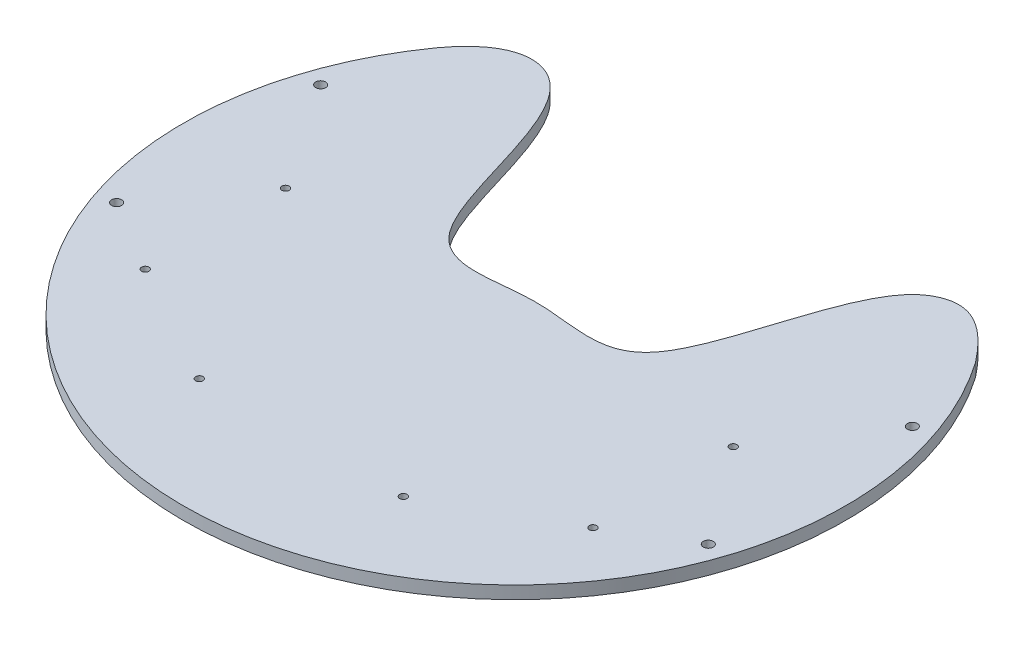
ISO-10303-21;
HEADER;
FILE_DESCRIPTION(('STEP AP214'),'2;1');
FILE_NAME('part.step','',(''),(''),'','','');
FILE_SCHEMA(('AUTOMOTIVE_DESIGN { 1 0 10303 214 1 1 1 1 }'));
ENDSEC;
DATA;
#1=APPLICATION_CONTEXT('core data for automotive mechanical design processes');
#2=APPLICATION_PROTOCOL_DEFINITION('international standard','automotive_design',2000,#1);
#3=PRODUCT_CONTEXT('',#1,'mechanical');
#4=PRODUCT('Part','Part','',(#3));
#5=PRODUCT_RELATED_PRODUCT_CATEGORY('part','',(#4));
#6=PRODUCT_DEFINITION_FORMATION('','',#4);
#7=PRODUCT_DEFINITION_CONTEXT('part definition',#1,'design');
#8=PRODUCT_DEFINITION('design','',#6,#7);
#9=PRODUCT_DEFINITION_SHAPE('','',#8);
#10=(LENGTH_UNIT() NAMED_UNIT(*) SI_UNIT(.MILLI.,.METRE.));
#11=(NAMED_UNIT(*) PLANE_ANGLE_UNIT() SI_UNIT($,.RADIAN.));
#12=(NAMED_UNIT(*) SI_UNIT($,.STERADIAN.) SOLID_ANGLE_UNIT());
#13=UNCERTAINTY_MEASURE_WITH_UNIT(LENGTH_MEASURE(1.E-05),#10,'distance_accuracy_value','');
#14=(GEOMETRIC_REPRESENTATION_CONTEXT(3) GLOBAL_UNCERTAINTY_ASSIGNED_CONTEXT((#13)) GLOBAL_UNIT_ASSIGNED_CONTEXT((#10,
#11,#12)) REPRESENTATION_CONTEXT('',''));
#15=CARTESIAN_POINT('',(0.,0.,0.));
#16=DIRECTION('',(0.,0.,1.));
#17=DIRECTION('',(1.,0.,0.));
#18=AXIS2_PLACEMENT_3D('',#15,#16,#17);
#19=CARTESIAN_POINT('',(0.,6.35,0.));
#20=DIRECTION('',(0.,-1.,0.));
#21=DIRECTION('',(0.,0.,-1.));
#22=AXIS2_PLACEMENT_3D('',#19,#20,#21);
#23=CYLINDRICAL_SURFACE('',#22,164.975);
#24=DIRECTION('',(0.,-1.,0.));
#25=VECTOR('',#24,1.);
#26=CARTESIAN_POINT('',(135.559273801903,589.678712407293,-94.0235816766237));
#27=LINE('',#26,#25);
#28=CARTESIAN_POINT('',(135.559273801903,6.35,-94.0235816766237));
#29=VERTEX_POINT('',#28);
#30=CARTESIAN_POINT('',(135.559273801903,0.,-94.0235816766237));
#31=VERTEX_POINT('',#30);
#32=EDGE_CURVE('E71',#29,#31,#27,.T.);
#33=ORIENTED_EDGE('',*,*,#32,.F.);
#34=CARTESIAN_POINT('',(0.,6.35,0.));
#35=DIRECTION('',(0.,1.,0.));
#36=DIRECTION('',(0.,0.,1.));
#37=AXIS2_PLACEMENT_3D('',#34,#35,#36);
#38=CIRCLE('',#37,164.975);
#39=CARTESIAN_POINT('',(-134.51490515471,6.35,-95.5117318250461));
#40=VERTEX_POINT('',#39);
#41=EDGE_CURVE('E43',#40,#29,#38,.T.);
#42=ORIENTED_EDGE('',*,*,#41,.F.);
#43=DIRECTION('',(0.,-1.,0.));
#44=VECTOR('',#43,1.);
#45=CARTESIAN_POINT('',(-134.514905154706,589.678712407293,-95.5117318250508));
#46=LINE('',#45,#44);
#47=CARTESIAN_POINT('',(-134.51490515471,0.,-95.511731825046));
#48=VERTEX_POINT('',#47);
#49=EDGE_CURVE('E69',#48,#40,#46,.F.);
#50=ORIENTED_EDGE('',*,*,#49,.F.);
#51=CARTESIAN_POINT('',(0.,0.,0.));
#52=DIRECTION('',(0.,1.,0.));
#53=DIRECTION('',(0.,0.,1.));
#54=AXIS2_PLACEMENT_3D('',#51,#52,#53);
#55=CIRCLE('',#54,164.975);
#56=EDGE_CURVE('E61',#48,#31,#55,.T.);
#57=ORIENTED_EDGE('',*,*,#56,.T.);
#58=EDGE_LOOP('',(#33,#42,#50,#57));
#59=FACE_BOUND('',#58,.T.);
#60=ADVANCED_FACE('F35',(#59),#23,.T.);
#61=CARTESIAN_POINT('',(0.,6.35,0.));
#62=DIRECTION('',(0.,1.,0.));
#63=DIRECTION('',(0.,0.,1.));
#64=AXIS2_PLACEMENT_3D('',#61,#62,#63);
#65=PLANE('',#64);
#66=CARTESIAN_POINT('',(-147.32,6.35,-50.8));
#67=DIRECTION('',(0.,1.,0.));
#68=DIRECTION('',(0.,0.,1.));
#69=AXIS2_PLACEMENT_3D('',#66,#67,#68);
#70=CIRCLE('',#69,2.4892);
#71=CARTESIAN_POINT('',(-147.32,6.35,-48.3108));
#72=VERTEX_POINT('',#71);
#73=EDGE_CURVE('E272',#72,#72,#70,.T.);
#74=ORIENTED_EDGE('',*,*,#73,.F.);
#75=EDGE_LOOP('',(#74));
#76=FACE_BOUND('',#75,.T.);
#77=CARTESIAN_POINT('',(-147.32,6.35,50.8));
#78=DIRECTION('',(0.,1.,0.));
#79=DIRECTION('',(0.,0.,1.));
#80=AXIS2_PLACEMENT_3D('',#77,#78,#79);
#81=CIRCLE('',#80,2.4892);
#82=CARTESIAN_POINT('',(-147.32,6.35,53.2892));
#83=VERTEX_POINT('',#82);
#84=EDGE_CURVE('E274',#83,#83,#81,.T.);
#85=ORIENTED_EDGE('',*,*,#84,.F.);
#86=EDGE_LOOP('',(#85));
#87=FACE_BOUND('',#86,.T.);
#88=CARTESIAN_POINT('',(147.32,6.35,-50.8));
#89=DIRECTION('',(0.,1.,0.));
#90=DIRECTION('',(0.,0.,1.));
#91=AXIS2_PLACEMENT_3D('',#88,#89,#90);
#92=CIRCLE('',#91,2.4892);
#93=CARTESIAN_POINT('',(147.32,6.35,-48.3108));
#94=VERTEX_POINT('',#93);
#95=EDGE_CURVE('E282',#94,#94,#92,.T.);
#96=ORIENTED_EDGE('',*,*,#95,.F.);
#97=EDGE_LOOP('',(#96));
#98=FACE_BOUND('',#97,.T.);
#99=CARTESIAN_POINT('',(147.32,6.35,50.8));
#100=DIRECTION('',(0.,1.,0.));
#101=DIRECTION('',(0.,0.,1.));
#102=AXIS2_PLACEMENT_3D('',#99,#100,#101);
#103=CIRCLE('',#102,2.4892);
#104=CARTESIAN_POINT('',(147.32,6.35,53.2892));
#105=VERTEX_POINT('',#104);
#106=EDGE_CURVE('E288',#105,#105,#103,.T.);
#107=ORIENTED_EDGE('',*,*,#106,.F.);
#108=EDGE_LOOP('',(#107));
#109=FACE_BOUND('',#108,.T.);
#110=CARTESIAN_POINT('',(50.8,6.35,106.158945667331));
#111=DIRECTION('',(0.,1.,0.));
#112=DIRECTION('',(0.,0.,1.));
#113=AXIS2_PLACEMENT_3D('',#110,#111,#112);
#114=CIRCLE('',#113,1.82879999999999);
#115=CARTESIAN_POINT('',(50.8,6.35,107.987745667331));
#116=VERTEX_POINT('',#115);
#117=EDGE_CURVE('E294',#116,#116,#114,.T.);
#118=ORIENTED_EDGE('',*,*,#117,.F.);
#119=EDGE_LOOP('',(#118));
#120=FACE_BOUND('',#119,.T.);
#121=CARTESIAN_POINT('',(-50.8,6.35,106.158945667331));
#122=DIRECTION('',(0.,1.,0.));
#123=DIRECTION('',(0.,0.,1.));
#124=AXIS2_PLACEMENT_3D('',#121,#122,#123);
#125=CIRCLE('',#124,1.82879999999999);
#126=CARTESIAN_POINT('',(-50.8,6.35,107.987745667331));
#127=VERTEX_POINT('',#126);
#128=EDGE_CURVE('E77',#127,#127,#125,.T.);
#129=ORIENTED_EDGE('',*,*,#128,.F.);
#130=EDGE_LOOP('',(#129));
#131=FACE_BOUND('',#130,.T.);
#132=CARTESIAN_POINT('',(-111.465,6.35,2.54));
#133=DIRECTION('',(0.,-1.,0.));
#134=DIRECTION('',(0.,0.,-1.));
#135=AXIS2_PLACEMENT_3D('',#132,#133,#134);
#136=CIRCLE('',#135,1.82879999999999);
#137=CARTESIAN_POINT('',(-111.465,6.35,0.711200000000009));
#138=VERTEX_POINT('',#137);
#139=EDGE_CURVE('E66',#138,#138,#136,.T.);
#140=ORIENTED_EDGE('',*,*,#139,.T.);
#141=EDGE_LOOP('',(#140));
#142=FACE_BOUND('',#141,.T.);
#143=CARTESIAN_POINT('',(-111.465,6.35,72.39));
#144=DIRECTION('',(0.,-1.,0.));
#145=DIRECTION('',(0.,0.,-1.));
#146=AXIS2_PLACEMENT_3D('',#143,#144,#145);
#147=CIRCLE('',#146,1.82879999999999);
#148=CARTESIAN_POINT('',(-111.465,6.35,70.5612));
#149=VERTEX_POINT('',#148);
#150=EDGE_CURVE('E105',#149,#149,#147,.T.);
#151=ORIENTED_EDGE('',*,*,#150,.T.);
#152=EDGE_LOOP('',(#151));
#153=FACE_BOUND('',#152,.T.);
#154=CARTESIAN_POINT('',(111.465,6.35,2.54));
#155=DIRECTION('',(0.,-1.,0.));
#156=DIRECTION('',(0.,0.,-1.));
#157=AXIS2_PLACEMENT_3D('',#154,#155,#156);
#158=CIRCLE('',#157,1.82879999999999);
#159=CARTESIAN_POINT('',(111.465,6.35,0.711200000000009));
#160=VERTEX_POINT('',#159);
#161=EDGE_CURVE('E99',#160,#160,#158,.T.);
#162=ORIENTED_EDGE('',*,*,#161,.T.);
#163=EDGE_LOOP('',(#162));
#164=FACE_BOUND('',#163,.T.);
#165=CARTESIAN_POINT('',(111.465,6.35,72.39));
#166=DIRECTION('',(0.,-1.,0.));
#167=DIRECTION('',(0.,0.,-1.));
#168=AXIS2_PLACEMENT_3D('',#165,#166,#167);
#169=CIRCLE('',#168,1.82879999999999);
#170=CARTESIAN_POINT('',(111.465,6.35,70.5612));
#171=VERTEX_POINT('',#170);
#172=EDGE_CURVE('E93',#171,#171,#169,.T.);
#173=ORIENTED_EDGE('',*,*,#172,.T.);
#174=EDGE_LOOP('',(#173));
#175=FACE_BOUND('',#174,.T.);
#176=ORIENTED_EDGE('',*,*,#41,.T.);
#177=CARTESIAN_POINT('',(-135.559273801902,6.34999999999997,-94.0235816766245));
#178=CARTESIAN_POINT('',(-123.865738236216,6.34999999999997,-111.077159006112));
#179=CARTESIAN_POINT('',(-106.449977637645,6.34999999999997,-118.585350672143));
#180=CARTESIAN_POINT('',(-71.3901870554499,6.34999999999997,-97.759614566911));
#181=CARTESIAN_POINT('',(-62.1016103392255,6.34999999999997,5.97104789695598));
#182=CARTESIAN_POINT('',(0.172013058589702,6.34999999999997,-18.1838006858238));
#183=CARTESIAN_POINT('',(61.3361651321419,6.34999999999997,6.05350296978897));
#184=CARTESIAN_POINT('',(73.4950138951308,6.34999999999997,-97.956010729616));
#185=CARTESIAN_POINT('',(105.334247952647,6.34999999999997,-118.220752119144));
#186=CARTESIAN_POINT('',(120.05372767283,6.34999999999997,-114.006940105104));
#187=CARTESIAN_POINT('',(135.559273801903,6.34999999999997,-94.0235816766237));
#188=B_SPLINE_CURVE_WITH_KNOTS('',3,(#177,#178,#179,#180,#181,#182,#183,#184,#185,#186,#187),
.UNSPECIFIED.,.F.,.F.,(4,1,1,1,1,1,1,1,4),(0.,0.0968227127982241,0.130284198374629,
0.33461485576405,0.501420490021093,0.66822612427814,0.872556781883865,0.905734169456051,1.),.UNSPECIFIED.);
#189=EDGE_CURVE('E50',#29,#40,#188,.F.);
#190=ORIENTED_EDGE('',*,*,#189,.T.);
#191=EDGE_LOOP('',(#176,#190));
#192=FACE_BOUND('',#191,.T.);
#193=ADVANCED_FACE('F120',(#76,#87,#98,#109,#120,#131,#142,#153,#164,#175,#192),#65,.T.);
#194=CARTESIAN_POINT('',(0.,0.,0.));
#195=DIRECTION('',(0.,1.,0.));
#196=DIRECTION('',(0.,0.,1.));
#197=AXIS2_PLACEMENT_3D('',#194,#195,#196);
#198=PLANE('',#197);
#199=CARTESIAN_POINT('',(-147.32,1.43982048506075E-13,-50.8));
#200=DIRECTION('',(0.,1.,0.));
#201=DIRECTION('',(0.,0.,1.));
#202=AXIS2_PLACEMENT_3D('',#199,#200,#201);
#203=CIRCLE('',#202,2.48919999999975);
#204=CARTESIAN_POINT('',(-147.32,1.43982048506075E-13,-48.3108000000002));
#205=VERTEX_POINT('',#204);
#206=EDGE_CURVE('E270',#205,#205,#203,.T.);
#207=ORIENTED_EDGE('',*,*,#206,.T.);
#208=EDGE_LOOP('',(#207));
#209=FACE_BOUND('',#208,.T.);
#210=CARTESIAN_POINT('',(-147.32,1.43982048506075E-13,50.8));
#211=DIRECTION('',(0.,1.,0.));
#212=DIRECTION('',(0.,0.,1.));
#213=AXIS2_PLACEMENT_3D('',#210,#211,#212);
#214=CIRCLE('',#213,2.48919999999975);
#215=CARTESIAN_POINT('',(-147.32,1.43982048506075E-13,53.2891999999997));
#216=VERTEX_POINT('',#215);
#217=EDGE_CURVE('E279',#216,#216,#214,.T.);
#218=ORIENTED_EDGE('',*,*,#217,.T.);
#219=EDGE_LOOP('',(#218));
#220=FACE_BOUND('',#219,.T.);
#221=CARTESIAN_POINT('',(147.32,1.43982048506075E-13,-50.8));
#222=DIRECTION('',(0.,1.,0.));
#223=DIRECTION('',(0.,0.,1.));
#224=AXIS2_PLACEMENT_3D('',#221,#222,#223);
#225=CIRCLE('',#224,2.48919999999975);
#226=CARTESIAN_POINT('',(147.32,1.43982048506075E-13,-48.3108000000002));
#227=VERTEX_POINT('',#226);
#228=EDGE_CURVE('E285',#227,#227,#225,.T.);
#229=ORIENTED_EDGE('',*,*,#228,.T.);
#230=EDGE_LOOP('',(#229));
#231=FACE_BOUND('',#230,.T.);
#232=CARTESIAN_POINT('',(147.32,1.43982048506075E-13,50.8));
#233=DIRECTION('',(0.,1.,0.));
#234=DIRECTION('',(0.,0.,1.));
#235=AXIS2_PLACEMENT_3D('',#232,#233,#234);
#236=CIRCLE('',#235,2.48919999999975);
#237=CARTESIAN_POINT('',(147.32,1.43982048506075E-13,53.2891999999997));
#238=VERTEX_POINT('',#237);
#239=EDGE_CURVE('E291',#238,#238,#236,.T.);
#240=ORIENTED_EDGE('',*,*,#239,.T.);
#241=EDGE_LOOP('',(#240));
#242=FACE_BOUND('',#241,.T.);
#243=CARTESIAN_POINT('',(50.8,0.,106.158945667331));
#244=DIRECTION('',(0.,1.,0.));
#245=DIRECTION('',(0.,0.,1.));
#246=AXIS2_PLACEMENT_3D('',#243,#244,#245);
#247=CIRCLE('',#246,1.82879999999999);
#248=CARTESIAN_POINT('',(50.8,0.,107.987745667331));
#249=VERTEX_POINT('',#248);
#250=EDGE_CURVE('E38',#249,#249,#247,.T.);
#251=ORIENTED_EDGE('',*,*,#250,.T.);
#252=EDGE_LOOP('',(#251));
#253=FACE_BOUND('',#252,.T.);
#254=CARTESIAN_POINT('',(-50.8,0.,106.158945667331));
#255=DIRECTION('',(0.,1.,0.));
#256=DIRECTION('',(0.,0.,1.));
#257=AXIS2_PLACEMENT_3D('',#254,#255,#256);
#258=CIRCLE('',#257,1.82879999999999);
#259=CARTESIAN_POINT('',(-50.8,0.,107.987745667331));
#260=VERTEX_POINT('',#259);
#261=EDGE_CURVE('E74',#260,#260,#258,.T.);
#262=ORIENTED_EDGE('',*,*,#261,.T.);
#263=EDGE_LOOP('',(#262));
#264=FACE_BOUND('',#263,.T.);
#265=CARTESIAN_POINT('',(-111.465,0.,2.54));
#266=DIRECTION('',(0.,-1.,0.));
#267=DIRECTION('',(0.,0.,-1.));
#268=AXIS2_PLACEMENT_3D('',#265,#266,#267);
#269=CIRCLE('',#268,1.82879999999999);
#270=CARTESIAN_POINT('',(-111.465,0.,0.711200000000009));
#271=VERTEX_POINT('',#270);
#272=EDGE_CURVE('E108',#271,#271,#269,.T.);
#273=ORIENTED_EDGE('',*,*,#272,.F.);
#274=EDGE_LOOP('',(#273));
#275=FACE_BOUND('',#274,.T.);
#276=CARTESIAN_POINT('',(-111.465,0.,72.39));
#277=DIRECTION('',(0.,-1.,0.));
#278=DIRECTION('',(0.,0.,-1.));
#279=AXIS2_PLACEMENT_3D('',#276,#277,#278);
#280=CIRCLE('',#279,1.82879999999999);
#281=CARTESIAN_POINT('',(-111.465,0.,70.5612));
#282=VERTEX_POINT('',#281);
#283=EDGE_CURVE('E102',#282,#282,#280,.T.);
#284=ORIENTED_EDGE('',*,*,#283,.F.);
#285=EDGE_LOOP('',(#284));
#286=FACE_BOUND('',#285,.T.);
#287=CARTESIAN_POINT('',(111.465,0.,2.54));
#288=DIRECTION('',(0.,-1.,0.));
#289=DIRECTION('',(0.,0.,-1.));
#290=AXIS2_PLACEMENT_3D('',#287,#288,#289);
#291=CIRCLE('',#290,1.82879999999999);
#292=CARTESIAN_POINT('',(111.465,0.,0.711200000000009));
#293=VERTEX_POINT('',#292);
#294=EDGE_CURVE('E96',#293,#293,#291,.T.);
#295=ORIENTED_EDGE('',*,*,#294,.F.);
#296=EDGE_LOOP('',(#295));
#297=FACE_BOUND('',#296,.T.);
#298=CARTESIAN_POINT('',(111.465,0.,72.39));
#299=DIRECTION('',(0.,-1.,0.));
#300=DIRECTION('',(0.,0.,-1.));
#301=AXIS2_PLACEMENT_3D('',#298,#299,#300);
#302=CIRCLE('',#301,1.82879999999999);
#303=CARTESIAN_POINT('',(111.465,0.,70.5612));
#304=VERTEX_POINT('',#303);
#305=EDGE_CURVE('E87',#304,#304,#302,.T.);
#306=ORIENTED_EDGE('',*,*,#305,.F.);
#307=EDGE_LOOP('',(#306));
#308=FACE_BOUND('',#307,.T.);
#309=CARTESIAN_POINT('',(-135.559273801902,0.,-94.0235816766245));
#310=CARTESIAN_POINT('',(-123.865738236216,0.,-111.077159006112));
#311=CARTESIAN_POINT('',(-106.449977637645,0.,-118.585350672143));
#312=CARTESIAN_POINT('',(-71.3901870554499,0.,-97.759614566911));
#313=CARTESIAN_POINT('',(-62.1016103392255,0.,5.97104789695598));
#314=CARTESIAN_POINT('',(0.172013058589702,0.,-18.1838006858238));
#315=CARTESIAN_POINT('',(61.3361651321419,0.,6.05350296978897));
#316=CARTESIAN_POINT('',(73.4950138951308,0.,-97.956010729616));
#317=CARTESIAN_POINT('',(105.334247952647,0.,-118.220752119144));
#318=CARTESIAN_POINT('',(120.05372767283,0.,-114.006940105104));
#319=CARTESIAN_POINT('',(135.559273801903,0.,-94.0235816766237));
#320=B_SPLINE_CURVE_WITH_KNOTS('',3,(#309,#310,#311,#312,#313,#314,#315,#316,#317,#318,#319),
.UNSPECIFIED.,.F.,.F.,(4,1,1,1,1,1,1,1,4),(0.,0.0968227127982241,0.130284198374629,
0.33461485576405,0.501420490021093,0.66822612427814,0.872556781883865,0.905734169456051,1.),.UNSPECIFIED.);
#321=EDGE_CURVE('E11',#31,#48,#320,.F.);
#322=ORIENTED_EDGE('',*,*,#321,.F.);
#323=ORIENTED_EDGE('',*,*,#56,.F.);
#324=EDGE_LOOP('',(#322,#323));
#325=FACE_BOUND('',#324,.T.);
#326=ADVANCED_FACE('F63',(#209,#220,#231,#242,#253,#264,#275,#286,#297,#308,#325),#198,.F.);
#327=CARTESIAN_POINT('',(-111.465,0.,2.54));
#328=DIRECTION('',(0.,-1.,0.));
#329=DIRECTION('',(0.,0.,-1.));
#330=AXIS2_PLACEMENT_3D('',#327,#328,#329);
#331=CYLINDRICAL_SURFACE('',#330,1.82879999999999);
#332=ORIENTED_EDGE('',*,*,#139,.F.);
#333=EDGE_LOOP('',(#332));
#334=FACE_BOUND('',#333,.T.);
#335=ORIENTED_EDGE('',*,*,#272,.T.);
#336=EDGE_LOOP('',(#335));
#337=FACE_BOUND('',#336,.T.);
#338=ADVANCED_FACE('F123',(#334,#337),#331,.F.);
#339=CARTESIAN_POINT('',(-111.465,0.,72.39));
#340=DIRECTION('',(0.,-1.,0.));
#341=DIRECTION('',(0.,0.,-1.));
#342=AXIS2_PLACEMENT_3D('',#339,#340,#341);
#343=CYLINDRICAL_SURFACE('',#342,1.82879999999999);
#344=ORIENTED_EDGE('',*,*,#150,.F.);
#345=EDGE_LOOP('',(#344));
#346=FACE_BOUND('',#345,.T.);
#347=ORIENTED_EDGE('',*,*,#283,.T.);
#348=EDGE_LOOP('',(#347));
#349=FACE_BOUND('',#348,.T.);
#350=ADVANCED_FACE('F126',(#346,#349),#343,.F.);
#351=CARTESIAN_POINT('',(111.465,0.,2.54));
#352=DIRECTION('',(0.,-1.,0.));
#353=DIRECTION('',(0.,0.,-1.));
#354=AXIS2_PLACEMENT_3D('',#351,#352,#353);
#355=CYLINDRICAL_SURFACE('',#354,1.82879999999999);
#356=ORIENTED_EDGE('',*,*,#161,.F.);
#357=EDGE_LOOP('',(#356));
#358=FACE_BOUND('',#357,.T.);
#359=ORIENTED_EDGE('',*,*,#294,.T.);
#360=EDGE_LOOP('',(#359));
#361=FACE_BOUND('',#360,.T.);
#362=ADVANCED_FACE('F141',(#358,#361),#355,.F.);
#363=CARTESIAN_POINT('',(111.465,0.,72.39));
#364=DIRECTION('',(0.,-1.,0.));
#365=DIRECTION('',(0.,0.,-1.));
#366=AXIS2_PLACEMENT_3D('',#363,#364,#365);
#367=CYLINDRICAL_SURFACE('',#366,1.82879999999999);
#368=ORIENTED_EDGE('',*,*,#172,.F.);
#369=EDGE_LOOP('',(#368));
#370=FACE_BOUND('',#369,.T.);
#371=ORIENTED_EDGE('',*,*,#305,.T.);
#372=EDGE_LOOP('',(#371));
#373=FACE_BOUND('',#372,.T.);
#374=ADVANCED_FACE('F139',(#370,#373),#367,.F.);
#375=CARTESIAN_POINT('',(-135.559273801902,589.678712407293,-94.0235816766245));
#376=CARTESIAN_POINT('',(-123.865738236216,589.678712407293,-111.077159006112));
#377=CARTESIAN_POINT('',(-106.449977637645,589.678712407293,-118.585350672143));
#378=CARTESIAN_POINT('',(-71.3901870554499,589.678712407293,-97.759614566911));
#379=CARTESIAN_POINT('',(-62.1016103392255,589.678712407293,5.97104789695598));
#380=CARTESIAN_POINT('',(0.172013058589702,589.678712407293,-18.1838006858238));
#381=CARTESIAN_POINT('',(61.3361651321419,589.678712407293,6.05350296978897));
#382=CARTESIAN_POINT('',(73.4950138951308,589.678712407293,-97.956010729616));
#383=CARTESIAN_POINT('',(105.334247952647,589.678712407293,-118.220752119144));
#384=CARTESIAN_POINT('',(120.05372767283,589.678712407293,-114.006940105104));
#385=CARTESIAN_POINT('',(135.559273801903,589.678712407293,-94.0235816766237));
#386=B_SPLINE_CURVE_WITH_KNOTS('',3,(#375,#376,#377,#378,#379,#380,#381,#382,#383,#384,#385),
.UNSPECIFIED.,.F.,.F.,(4,1,1,1,1,1,1,1,4),(0.,0.0968227127982241,0.130284198374629,
0.33461485576405,0.501420490021093,0.66822612427814,0.872556781883865,0.905734169456051,1.),.UNSPECIFIED.);
#387=DIRECTION('',(0.,-1.,0.));
#388=VECTOR('',#387,1.);
#389=SURFACE_OF_LINEAR_EXTRUSION('',#386,#388);
#390=ORIENTED_EDGE('',*,*,#189,.F.);
#391=ORIENTED_EDGE('',*,*,#32,.T.);
#392=ORIENTED_EDGE('',*,*,#321,.T.);
#393=ORIENTED_EDGE('',*,*,#49,.T.);
#394=EDGE_LOOP('',(#390,#391,#392,#393));
#395=FACE_BOUND('',#394,.T.);
#396=ADVANCED_FACE('F73',(#395),#389,.T.);
#397=CARTESIAN_POINT('',(-50.8,6.35,106.158945667331));
#398=DIRECTION('',(0.,1.,0.));
#399=DIRECTION('',(0.,0.,1.));
#400=AXIS2_PLACEMENT_3D('',#397,#398,#399);
#401=CYLINDRICAL_SURFACE('',#400,1.82879999999999);
#402=ORIENTED_EDGE('',*,*,#128,.T.);
#403=EDGE_LOOP('',(#402));
#404=FACE_BOUND('',#403,.T.);
#405=ORIENTED_EDGE('',*,*,#261,.F.);
#406=EDGE_LOOP('',(#405));
#407=FACE_BOUND('',#406,.T.);
#408=ADVANCED_FACE('F149',(#404,#407),#401,.F.);
#409=CARTESIAN_POINT('',(50.8,6.35,106.158945667331));
#410=DIRECTION('',(0.,1.,0.));
#411=DIRECTION('',(0.,0.,1.));
#412=AXIS2_PLACEMENT_3D('',#409,#410,#411);
#413=CYLINDRICAL_SURFACE('',#412,1.82879999999999);
#414=ORIENTED_EDGE('',*,*,#117,.T.);
#415=EDGE_LOOP('',(#414));
#416=FACE_BOUND('',#415,.T.);
#417=ORIENTED_EDGE('',*,*,#250,.F.);
#418=EDGE_LOOP('',(#417));
#419=FACE_BOUND('',#418,.T.);
#420=ADVANCED_FACE('F215',(#416,#419),#413,.F.);
#421=CARTESIAN_POINT('',(147.32,6.35,50.8));
#422=DIRECTION('',(0.,1.,0.));
#423=DIRECTION('',(0.,0.,1.));
#424=AXIS2_PLACEMENT_3D('',#421,#422,#423);
#425=CYLINDRICAL_SURFACE('',#424,2.48919999999987);
#426=ORIENTED_EDGE('',*,*,#239,.F.);
#427=EDGE_LOOP('',(#426));
#428=FACE_BOUND('',#427,.T.);
#429=ORIENTED_EDGE('',*,*,#106,.T.);
#430=EDGE_LOOP('',(#429));
#431=FACE_BOUND('',#430,.T.);
#432=ADVANCED_FACE('F223',(#428,#431),#425,.F.);
#433=CARTESIAN_POINT('',(147.32,6.35,-50.8));
#434=DIRECTION('',(0.,1.,0.));
#435=DIRECTION('',(0.,0.,1.));
#436=AXIS2_PLACEMENT_3D('',#433,#434,#435);
#437=CYLINDRICAL_SURFACE('',#436,2.48919999999987);
#438=ORIENTED_EDGE('',*,*,#228,.F.);
#439=EDGE_LOOP('',(#438));
#440=FACE_BOUND('',#439,.T.);
#441=ORIENTED_EDGE('',*,*,#95,.T.);
#442=EDGE_LOOP('',(#441));
#443=FACE_BOUND('',#442,.T.);
#444=ADVANCED_FACE('F231',(#440,#443),#437,.F.);
#445=CARTESIAN_POINT('',(-147.32,6.35,50.8));
#446=DIRECTION('',(0.,1.,0.));
#447=DIRECTION('',(0.,0.,1.));
#448=AXIS2_PLACEMENT_3D('',#445,#446,#447);
#449=CYLINDRICAL_SURFACE('',#448,2.48919999999987);
#450=ORIENTED_EDGE('',*,*,#217,.F.);
#451=EDGE_LOOP('',(#450));
#452=FACE_BOUND('',#451,.T.);
#453=ORIENTED_EDGE('',*,*,#84,.T.);
#454=EDGE_LOOP('',(#453));
#455=FACE_BOUND('',#454,.T.);
#456=ADVANCED_FACE('F240',(#452,#455),#449,.F.);
#457=CARTESIAN_POINT('',(-147.32,6.35,-50.8));
#458=DIRECTION('',(0.,1.,0.));
#459=DIRECTION('',(0.,0.,1.));
#460=AXIS2_PLACEMENT_3D('',#457,#458,#459);
#461=CYLINDRICAL_SURFACE('',#460,2.48919999999987);
#462=ORIENTED_EDGE('',*,*,#206,.F.);
#463=EDGE_LOOP('',(#462));
#464=FACE_BOUND('',#463,.T.);
#465=ORIENTED_EDGE('',*,*,#73,.T.);
#466=EDGE_LOOP('',(#465));
#467=FACE_BOUND('',#466,.T.);
#468=ADVANCED_FACE('F249',(#464,#467),#461,.F.);
#469=CLOSED_SHELL('',(#60,#193,#326,#338,#350,#362,#374,#396,#408,#420,#432,#444,#456,#468));
#470=MANIFOLD_SOLID_BREP('B2',#469);
#471=ADVANCED_BREP_SHAPE_REPRESENTATION('',(#18,#470),#14);
#472=SHAPE_DEFINITION_REPRESENTATION(#9,#471);
ENDSEC;
END-ISO-10303-21;
